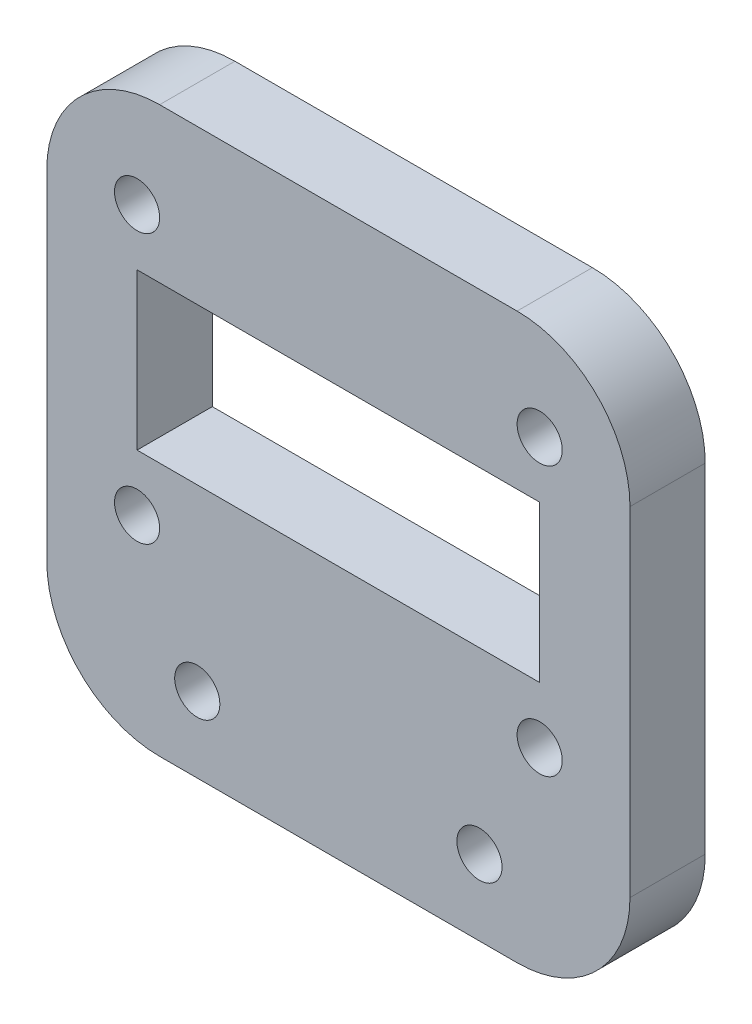
ISO-10303-21;
HEADER;
FILE_DESCRIPTION(('STEP AP214'),'2;1');
FILE_NAME('part.step','',(''),(''),'','','');
FILE_SCHEMA(('AUTOMOTIVE_DESIGN { 1 0 10303 214 1 1 1 1 }'));
ENDSEC;
DATA;
#1=APPLICATION_CONTEXT('core data for automotive mechanical design processes');
#2=APPLICATION_PROTOCOL_DEFINITION('international standard','automotive_design',2000,#1);
#3=PRODUCT_CONTEXT('',#1,'mechanical');
#4=PRODUCT('Part','Part','',(#3));
#5=PRODUCT_RELATED_PRODUCT_CATEGORY('part','',(#4));
#6=PRODUCT_DEFINITION_FORMATION('','',#4);
#7=PRODUCT_DEFINITION_CONTEXT('part definition',#1,'design');
#8=PRODUCT_DEFINITION('design','',#6,#7);
#9=PRODUCT_DEFINITION_SHAPE('','',#8);
#10=(LENGTH_UNIT() NAMED_UNIT(*) SI_UNIT(.MILLI.,.METRE.));
#11=(NAMED_UNIT(*) PLANE_ANGLE_UNIT() SI_UNIT($,.RADIAN.));
#12=(NAMED_UNIT(*) SI_UNIT($,.STERADIAN.) SOLID_ANGLE_UNIT());
#13=UNCERTAINTY_MEASURE_WITH_UNIT(LENGTH_MEASURE(1.E-05),#10,'distance_accuracy_value','');
#14=(GEOMETRIC_REPRESENTATION_CONTEXT(3) GLOBAL_UNCERTAINTY_ASSIGNED_CONTEXT((#13)) GLOBAL_UNIT_ASSIGNED_CONTEXT((#10,
#11,#12)) REPRESENTATION_CONTEXT('',''));
#15=CARTESIAN_POINT('',(0.,0.,0.));
#16=DIRECTION('',(0.,0.,1.));
#17=DIRECTION('',(1.,0.,0.));
#18=AXIS2_PLACEMENT_3D('',#15,#16,#17);
#19=CARTESIAN_POINT('',(0.,-15.,4.));
#20=DIRECTION('',(0.,1.,0.));
#21=DIRECTION('',(0.,0.,1.));
#22=AXIS2_PLACEMENT_3D('',#19,#20,#21);
#23=PLANE('',#22);
#24=DIRECTION('',(1.,0.,0.));
#25=VECTOR('',#24,1.);
#26=CARTESIAN_POINT('',(0.,-15.,0.));
#27=LINE('',#26,#25);
#28=CARTESIAN_POINT('',(-9.5,-15.,0.));
#29=VERTEX_POINT('',#28);
#30=CARTESIAN_POINT('',(9.5,-15.,0.));
#31=VERTEX_POINT('',#30);
#32=EDGE_CURVE('E213',#29,#31,#27,.T.);
#33=ORIENTED_EDGE('',*,*,#32,.T.);
#34=DIRECTION('',(0.,0.,-1.));
#35=VECTOR('',#34,1.);
#36=CARTESIAN_POINT('',(9.5,-15.,4.));
#37=LINE('',#36,#35);
#38=CARTESIAN_POINT('',(9.5,-15.,4.));
#39=VERTEX_POINT('',#38);
#40=EDGE_CURVE('E243',#31,#39,#37,.F.);
#41=ORIENTED_EDGE('',*,*,#40,.T.);
#42=DIRECTION('',(1.,0.,0.));
#43=VECTOR('',#42,1.);
#44=CARTESIAN_POINT('',(0.,-15.,4.));
#45=LINE('',#44,#43);
#46=CARTESIAN_POINT('',(-9.5,-15.,4.));
#47=VERTEX_POINT('',#46);
#48=EDGE_CURVE('E173',#47,#39,#45,.T.);
#49=ORIENTED_EDGE('',*,*,#48,.F.);
#50=DIRECTION('',(0.,0.,-1.));
#51=VECTOR('',#50,1.);
#52=CARTESIAN_POINT('',(-9.5,-15.,0.));
#53=LINE('',#52,#51);
#54=EDGE_CURVE('E240',#47,#29,#53,.T.);
#55=ORIENTED_EDGE('',*,*,#54,.T.);
#56=EDGE_LOOP('',(#33,#41,#49,#55));
#57=FACE_BOUND('',#56,.T.);
#58=ADVANCED_FACE('F39',(#57),#23,.F.);
#59=CARTESIAN_POINT('',(15.5,0.,4.));
#60=DIRECTION('',(-1.,0.,0.));
#61=DIRECTION('',(0.,0.,1.));
#62=AXIS2_PLACEMENT_3D('',#59,#60,#61);
#63=PLANE('',#62);
#64=DIRECTION('',(0.,1.,0.));
#65=VECTOR('',#64,1.);
#66=CARTESIAN_POINT('',(15.5,0.,4.));
#67=LINE('',#66,#65);
#68=CARTESIAN_POINT('',(15.5,-9.,4.));
#69=VERTEX_POINT('',#68);
#70=CARTESIAN_POINT('',(15.5,9.,4.));
#71=VERTEX_POINT('',#70);
#72=EDGE_CURVE('E176',#69,#71,#67,.T.);
#73=ORIENTED_EDGE('',*,*,#72,.F.);
#74=DIRECTION('',(0.,0.,-1.));
#75=VECTOR('',#74,1.);
#76=CARTESIAN_POINT('',(15.5,-9.,4.));
#77=LINE('',#76,#75);
#78=CARTESIAN_POINT('',(15.5,-9.,0.));
#79=VERTEX_POINT('',#78);
#80=EDGE_CURVE('E229',#69,#79,#77,.T.);
#81=ORIENTED_EDGE('',*,*,#80,.T.);
#82=DIRECTION('',(0.,1.,0.));
#83=VECTOR('',#82,1.);
#84=CARTESIAN_POINT('',(15.5,0.,0.));
#85=LINE('',#84,#83);
#86=CARTESIAN_POINT('',(15.5,9.,0.));
#87=VERTEX_POINT('',#86);
#88=EDGE_CURVE('E216',#79,#87,#85,.T.);
#89=ORIENTED_EDGE('',*,*,#88,.T.);
#90=DIRECTION('',(0.,0.,-1.));
#91=VECTOR('',#90,1.);
#92=CARTESIAN_POINT('',(15.5,9.,4.));
#93=LINE('',#92,#91);
#94=EDGE_CURVE('E140',#87,#71,#93,.F.);
#95=ORIENTED_EDGE('',*,*,#94,.T.);
#96=EDGE_LOOP('',(#73,#81,#89,#95));
#97=FACE_BOUND('',#96,.T.);
#98=ADVANCED_FACE('F285',(#97),#63,.F.);
#99=CARTESIAN_POINT('',(0.,15.,4.));
#100=DIRECTION('',(0.,1.,0.));
#101=DIRECTION('',(0.,0.,1.));
#102=AXIS2_PLACEMENT_3D('',#99,#100,#101);
#103=PLANE('',#102);
#104=DIRECTION('',(1.,0.,0.));
#105=VECTOR('',#104,1.);
#106=CARTESIAN_POINT('',(0.,15.,0.));
#107=LINE('',#106,#105);
#108=CARTESIAN_POINT('',(-9.5,15.,0.));
#109=VERTEX_POINT('',#108);
#110=CARTESIAN_POINT('',(9.5,15.,0.));
#111=VERTEX_POINT('',#110);
#112=EDGE_CURVE('E219',#109,#111,#107,.T.);
#113=ORIENTED_EDGE('',*,*,#112,.F.);
#114=DIRECTION('',(0.,0.,-1.));
#115=VECTOR('',#114,1.);
#116=CARTESIAN_POINT('',(-9.5,15.,4.));
#117=LINE('',#116,#115);
#118=CARTESIAN_POINT('',(-9.5,15.,4.));
#119=VERTEX_POINT('',#118);
#120=EDGE_CURVE('E11',#109,#119,#117,.F.);
#121=ORIENTED_EDGE('',*,*,#120,.T.);
#122=DIRECTION('',(1.,0.,0.));
#123=VECTOR('',#122,1.);
#124=CARTESIAN_POINT('',(0.,15.,4.));
#125=LINE('',#124,#123);
#126=CARTESIAN_POINT('',(9.5,15.,4.));
#127=VERTEX_POINT('',#126);
#128=EDGE_CURVE('E179',#119,#127,#125,.T.);
#129=ORIENTED_EDGE('',*,*,#128,.T.);
#130=DIRECTION('',(0.,0.,-1.));
#131=VECTOR('',#130,1.);
#132=CARTESIAN_POINT('',(9.5,15.,0.));
#133=LINE('',#132,#131);
#134=EDGE_CURVE('E47',#127,#111,#133,.T.);
#135=ORIENTED_EDGE('',*,*,#134,.T.);
#136=EDGE_LOOP('',(#113,#121,#129,#135));
#137=FACE_BOUND('',#136,.T.);
#138=ADVANCED_FACE('F259',(#137),#103,.T.);
#139=CARTESIAN_POINT('',(-10.7,0.,4.));
#140=DIRECTION('',(1.,0.,0.));
#141=DIRECTION('',(0.,0.,-1.));
#142=AXIS2_PLACEMENT_3D('',#139,#140,#141);
#143=PLANE('',#142);
#144=DIRECTION('',(0.,-1.,0.));
#145=VECTOR('',#144,1.);
#146=CARTESIAN_POINT('',(-10.7,0.,0.));
#147=LINE('',#146,#145);
#148=CARTESIAN_POINT('',(-10.7,6.8,0.));
#149=VERTEX_POINT('',#148);
#150=CARTESIAN_POINT('',(-10.7,-1.5,0.));
#151=VERTEX_POINT('',#150);
#152=EDGE_CURVE('E136',#149,#151,#147,.T.);
#153=ORIENTED_EDGE('',*,*,#152,.F.);
#154=DIRECTION('',(0.,0.,-1.));
#155=VECTOR('',#154,1.);
#156=CARTESIAN_POINT('',(-10.7,6.8,4.));
#157=LINE('',#156,#155);
#158=CARTESIAN_POINT('',(-10.7,6.8,4.));
#159=VERTEX_POINT('',#158);
#160=EDGE_CURVE('E129',#159,#149,#157,.T.);
#161=ORIENTED_EDGE('',*,*,#160,.F.);
#162=DIRECTION('',(0.,-1.,0.));
#163=VECTOR('',#162,1.);
#164=CARTESIAN_POINT('',(-10.7,0.,4.));
#165=LINE('',#164,#163);
#166=CARTESIAN_POINT('',(-10.7,-1.5,4.));
#167=VERTEX_POINT('',#166);
#168=EDGE_CURVE('E133',#159,#167,#165,.T.);
#169=ORIENTED_EDGE('',*,*,#168,.T.);
#170=DIRECTION('',(0.,0.,-1.));
#171=VECTOR('',#170,1.);
#172=CARTESIAN_POINT('',(-10.7,-1.5,4.));
#173=LINE('',#172,#171);
#174=EDGE_CURVE('E190',#167,#151,#173,.T.);
#175=ORIENTED_EDGE('',*,*,#174,.T.);
#176=EDGE_LOOP('',(#153,#161,#169,#175));
#177=FACE_BOUND('',#176,.T.);
#178=ADVANCED_FACE('F131',(#177),#143,.T.);
#179=CARTESIAN_POINT('',(0.,6.8,4.));
#180=DIRECTION('',(0.,1.,0.));
#181=DIRECTION('',(0.,0.,1.));
#182=AXIS2_PLACEMENT_3D('',#179,#180,#181);
#183=PLANE('',#182);
#184=DIRECTION('',(1.,0.,0.));
#185=VECTOR('',#184,1.);
#186=CARTESIAN_POINT('',(0.,6.8,0.));
#187=LINE('',#186,#185);
#188=CARTESIAN_POINT('',(10.7,6.8,0.));
#189=VERTEX_POINT('',#188);
#190=EDGE_CURVE('E196',#149,#189,#187,.T.);
#191=ORIENTED_EDGE('',*,*,#190,.T.);
#192=DIRECTION('',(0.,0.,-1.));
#193=VECTOR('',#192,1.);
#194=CARTESIAN_POINT('',(10.7,6.8,4.));
#195=LINE('',#194,#193);
#196=CARTESIAN_POINT('',(10.7,6.8,4.));
#197=VERTEX_POINT('',#196);
#198=EDGE_CURVE('E141',#197,#189,#195,.T.);
#199=ORIENTED_EDGE('',*,*,#198,.F.);
#200=DIRECTION('',(1.,0.,0.));
#201=VECTOR('',#200,1.);
#202=CARTESIAN_POINT('',(0.,6.8,4.));
#203=LINE('',#202,#201);
#204=EDGE_CURVE('E145',#159,#197,#203,.T.);
#205=ORIENTED_EDGE('',*,*,#204,.F.);
#206=ORIENTED_EDGE('',*,*,#160,.T.);
#207=EDGE_LOOP('',(#191,#199,#205,#206));
#208=FACE_BOUND('',#207,.T.);
#209=ADVANCED_FACE('F146',(#208),#183,.F.);
#210=CARTESIAN_POINT('',(10.7,0.,4.));
#211=DIRECTION('',(1.,0.,0.));
#212=DIRECTION('',(0.,1.,0.));
#213=AXIS2_PLACEMENT_3D('',#210,#211,#212);
#214=PLANE('',#213);
#215=DIRECTION('',(0.,-1.,0.));
#216=VECTOR('',#215,1.);
#217=CARTESIAN_POINT('',(10.7,0.,0.));
#218=LINE('',#217,#216);
#219=CARTESIAN_POINT('',(10.7,-1.5,0.));
#220=VERTEX_POINT('',#219);
#221=EDGE_CURVE('E198',#189,#220,#218,.T.);
#222=ORIENTED_EDGE('',*,*,#221,.T.);
#223=DIRECTION('',(0.,0.,-1.));
#224=VECTOR('',#223,1.);
#225=CARTESIAN_POINT('',(10.7,-1.5,4.));
#226=LINE('',#225,#224);
#227=CARTESIAN_POINT('',(10.7,-1.5,4.));
#228=VERTEX_POINT('',#227);
#229=EDGE_CURVE('E225',#228,#220,#226,.T.);
#230=ORIENTED_EDGE('',*,*,#229,.F.);
#231=DIRECTION('',(0.,-1.,0.));
#232=VECTOR('',#231,1.);
#233=CARTESIAN_POINT('',(10.7,0.,4.));
#234=LINE('',#233,#232);
#235=EDGE_CURVE('E149',#197,#228,#234,.T.);
#236=ORIENTED_EDGE('',*,*,#235,.F.);
#237=ORIENTED_EDGE('',*,*,#198,.T.);
#238=EDGE_LOOP('',(#222,#230,#236,#237));
#239=FACE_BOUND('',#238,.T.);
#240=ADVANCED_FACE('F316',(#239),#214,.F.);
#241=CARTESIAN_POINT('',(-7.5,-11.,4.));
#242=DIRECTION('',(0.,0.,-1.));
#243=DIRECTION('',(-1.,0.,0.));
#244=AXIS2_PLACEMENT_3D('',#241,#242,#243);
#245=CYLINDRICAL_SURFACE('',#244,1.2);
#246=CARTESIAN_POINT('',(-7.5,-11.,2.));
#247=DIRECTION('',(0.,0.,1.));
#248=DIRECTION('',(1.,0.,0.));
#249=AXIS2_PLACEMENT_3D('',#246,#247,#248);
#250=CIRCLE('',#249,1.2);
#251=CARTESIAN_POINT('',(-6.3,-11.,2.));
#252=VERTEX_POINT('',#251);
#253=EDGE_CURVE('E572',#252,#252,#250,.T.);
#254=ORIENTED_EDGE('',*,*,#253,.F.);
#255=EDGE_LOOP('',(#254));
#256=FACE_BOUND('',#255,.T.);
#257=CARTESIAN_POINT('',(-7.5,-11.,4.));
#258=DIRECTION('',(0.,0.,1.));
#259=DIRECTION('',(1.,0.,0.));
#260=AXIS2_PLACEMENT_3D('',#257,#258,#259);
#261=CIRCLE('',#260,1.2);
#262=CARTESIAN_POINT('',(-6.3,-11.,4.));
#263=VERTEX_POINT('',#262);
#264=EDGE_CURVE('E184',#263,#263,#261,.T.);
#265=ORIENTED_EDGE('',*,*,#264,.T.);
#266=EDGE_LOOP('',(#265));
#267=FACE_BOUND('',#266,.T.);
#268=ADVANCED_FACE('F319',(#256,#267),#245,.F.);
#269=CARTESIAN_POINT('',(-15.5,0.,4.));
#270=DIRECTION('',(-1.,0.,0.));
#271=DIRECTION('',(0.,0.,1.));
#272=AXIS2_PLACEMENT_3D('',#269,#270,#271);
#273=PLANE('',#272);
#274=DIRECTION('',(0.,1.,0.));
#275=VECTOR('',#274,1.);
#276=CARTESIAN_POINT('',(-15.5,0.,0.));
#277=LINE('',#276,#275);
#278=CARTESIAN_POINT('',(-15.5,-9.,0.));
#279=VERTEX_POINT('',#278);
#280=CARTESIAN_POINT('',(-15.5,9.,0.));
#281=VERTEX_POINT('',#280);
#282=EDGE_CURVE('E158',#279,#281,#277,.T.);
#283=ORIENTED_EDGE('',*,*,#282,.F.);
#284=DIRECTION('',(0.,0.,-1.));
#285=VECTOR('',#284,1.);
#286=CARTESIAN_POINT('',(-15.5,-9.,4.));
#287=LINE('',#286,#285);
#288=CARTESIAN_POINT('',(-15.5,-9.,4.));
#289=VERTEX_POINT('',#288);
#290=EDGE_CURVE('E61',#279,#289,#287,.F.);
#291=ORIENTED_EDGE('',*,*,#290,.T.);
#292=DIRECTION('',(0.,1.,0.));
#293=VECTOR('',#292,1.);
#294=CARTESIAN_POINT('',(-15.5,0.,4.));
#295=LINE('',#294,#293);
#296=CARTESIAN_POINT('',(-15.5,9.,4.));
#297=VERTEX_POINT('',#296);
#298=EDGE_CURVE('E182',#289,#297,#295,.T.);
#299=ORIENTED_EDGE('',*,*,#298,.T.);
#300=DIRECTION('',(0.,0.,-1.));
#301=VECTOR('',#300,1.);
#302=CARTESIAN_POINT('',(-15.5,9.,4.));
#303=LINE('',#302,#301);
#304=EDGE_CURVE('E252',#297,#281,#303,.T.);
#305=ORIENTED_EDGE('',*,*,#304,.T.);
#306=EDGE_LOOP('',(#283,#291,#299,#305));
#307=FACE_BOUND('',#306,.T.);
#308=ADVANCED_FACE('F269',(#307),#273,.T.);
#309=CARTESIAN_POINT('',(10.7,9.8,4.));
#310=DIRECTION('',(0.,0.,-1.));
#311=DIRECTION('',(-1.,0.,0.));
#312=AXIS2_PLACEMENT_3D('',#309,#310,#311);
#313=CYLINDRICAL_SURFACE('',#312,1.2);
#314=CARTESIAN_POINT('',(10.7,9.8,4.));
#315=DIRECTION('',(0.,0.,1.));
#316=DIRECTION('',(1.,0.,0.));
#317=AXIS2_PLACEMENT_3D('',#314,#315,#316);
#318=CIRCLE('',#317,1.2);
#319=CARTESIAN_POINT('',(11.9,9.8,4.));
#320=VERTEX_POINT('',#319);
#321=EDGE_CURVE('E170',#320,#320,#318,.T.);
#322=ORIENTED_EDGE('',*,*,#321,.T.);
#323=EDGE_LOOP('',(#322));
#324=FACE_BOUND('',#323,.T.);
#325=CARTESIAN_POINT('',(10.7,9.8,0.));
#326=DIRECTION('',(0.,0.,1.));
#327=DIRECTION('',(1.,0.,0.));
#328=AXIS2_PLACEMENT_3D('',#325,#326,#327);
#329=CIRCLE('',#328,1.2);
#330=CARTESIAN_POINT('',(11.9,9.8,0.));
#331=VERTEX_POINT('',#330);
#332=EDGE_CURVE('E210',#331,#331,#329,.T.);
#333=ORIENTED_EDGE('',*,*,#332,.F.);
#334=EDGE_LOOP('',(#333));
#335=FACE_BOUND('',#334,.T.);
#336=ADVANCED_FACE('F299',(#324,#335),#313,.F.);
#337=CARTESIAN_POINT('',(10.7,-4.5,4.));
#338=DIRECTION('',(0.,0.,-1.));
#339=DIRECTION('',(-1.,0.,0.));
#340=AXIS2_PLACEMENT_3D('',#337,#338,#339);
#341=CYLINDRICAL_SURFACE('',#340,1.2);
#342=CARTESIAN_POINT('',(10.7,-4.5,4.));
#343=DIRECTION('',(0.,0.,1.));
#344=DIRECTION('',(1.,0.,0.));
#345=AXIS2_PLACEMENT_3D('',#342,#343,#344);
#346=CIRCLE('',#345,1.2);
#347=CARTESIAN_POINT('',(11.9,-4.5,4.));
#348=VERTEX_POINT('',#347);
#349=EDGE_CURVE('E167',#348,#348,#346,.T.);
#350=ORIENTED_EDGE('',*,*,#349,.T.);
#351=EDGE_LOOP('',(#350));
#352=FACE_BOUND('',#351,.T.);
#353=CARTESIAN_POINT('',(10.7,-4.5,0.));
#354=DIRECTION('',(0.,0.,1.));
#355=DIRECTION('',(1.,0.,0.));
#356=AXIS2_PLACEMENT_3D('',#353,#354,#355);
#357=CIRCLE('',#356,1.2);
#358=CARTESIAN_POINT('',(11.9,-4.5,0.));
#359=VERTEX_POINT('',#358);
#360=EDGE_CURVE('E207',#359,#359,#357,.T.);
#361=ORIENTED_EDGE('',*,*,#360,.F.);
#362=EDGE_LOOP('',(#361));
#363=FACE_BOUND('',#362,.T.);
#364=ADVANCED_FACE('F302',(#352,#363),#341,.F.);
#365=CARTESIAN_POINT('',(-10.7,9.8,4.));
#366=DIRECTION('',(0.,0.,-1.));
#367=DIRECTION('',(-1.,0.,0.));
#368=AXIS2_PLACEMENT_3D('',#365,#366,#367);
#369=CYLINDRICAL_SURFACE('',#368,1.2);
#370=CARTESIAN_POINT('',(-10.7,9.8,4.));
#371=DIRECTION('',(0.,0.,1.));
#372=DIRECTION('',(1.,0.,0.));
#373=AXIS2_PLACEMENT_3D('',#370,#371,#372);
#374=CIRCLE('',#373,1.2);
#375=CARTESIAN_POINT('',(-9.49999999999999,9.8,4.));
#376=VERTEX_POINT('',#375);
#377=EDGE_CURVE('E164',#376,#376,#374,.T.);
#378=ORIENTED_EDGE('',*,*,#377,.T.);
#379=EDGE_LOOP('',(#378));
#380=FACE_BOUND('',#379,.T.);
#381=CARTESIAN_POINT('',(-10.7,9.8,0.));
#382=DIRECTION('',(0.,0.,1.));
#383=DIRECTION('',(1.,0.,0.));
#384=AXIS2_PLACEMENT_3D('',#381,#382,#383);
#385=CIRCLE('',#384,1.2);
#386=CARTESIAN_POINT('',(-9.49999999999999,9.8,0.));
#387=VERTEX_POINT('',#386);
#388=EDGE_CURVE('E204',#387,#387,#385,.T.);
#389=ORIENTED_EDGE('',*,*,#388,.F.);
#390=EDGE_LOOP('',(#389));
#391=FACE_BOUND('',#390,.T.);
#392=ADVANCED_FACE('F306',(#380,#391),#369,.F.);
#393=CARTESIAN_POINT('',(0.,-1.5,4.));
#394=DIRECTION('',(0.,1.,0.));
#395=DIRECTION('',(0.,0.,1.));
#396=AXIS2_PLACEMENT_3D('',#393,#394,#395);
#397=PLANE('',#396);
#398=DIRECTION('',(1.,0.,0.));
#399=VECTOR('',#398,1.);
#400=CARTESIAN_POINT('',(0.,-1.5,0.));
#401=LINE('',#400,#399);
#402=EDGE_CURVE('E201',#151,#220,#401,.T.);
#403=ORIENTED_EDGE('',*,*,#402,.F.);
#404=ORIENTED_EDGE('',*,*,#174,.F.);
#405=DIRECTION('',(1.,0.,0.));
#406=VECTOR('',#405,1.);
#407=CARTESIAN_POINT('',(0.,-1.5,4.));
#408=LINE('',#407,#406);
#409=EDGE_CURVE('E154',#167,#228,#408,.T.);
#410=ORIENTED_EDGE('',*,*,#409,.T.);
#411=ORIENTED_EDGE('',*,*,#229,.T.);
#412=EDGE_LOOP('',(#403,#404,#410,#411));
#413=FACE_BOUND('',#412,.T.);
#414=ADVANCED_FACE('F310',(#413),#397,.T.);
#415=CARTESIAN_POINT('',(-10.7,-4.5,4.));
#416=DIRECTION('',(0.,0.,-1.));
#417=DIRECTION('',(-1.,0.,0.));
#418=AXIS2_PLACEMENT_3D('',#415,#416,#417);
#419=CYLINDRICAL_SURFACE('',#418,1.2);
#420=CARTESIAN_POINT('',(-10.7,-4.5,4.));
#421=DIRECTION('',(0.,0.,1.));
#422=DIRECTION('',(1.,0.,0.));
#423=AXIS2_PLACEMENT_3D('',#420,#421,#422);
#424=CIRCLE('',#423,1.2);
#425=CARTESIAN_POINT('',(-9.49999999999998,-4.5,4.));
#426=VERTEX_POINT('',#425);
#427=EDGE_CURVE('E155',#426,#426,#424,.T.);
#428=ORIENTED_EDGE('',*,*,#427,.T.);
#429=EDGE_LOOP('',(#428));
#430=FACE_BOUND('',#429,.T.);
#431=CARTESIAN_POINT('',(-10.7,-4.5,0.));
#432=DIRECTION('',(0.,0.,1.));
#433=DIRECTION('',(1.,0.,0.));
#434=AXIS2_PLACEMENT_3D('',#431,#432,#433);
#435=CIRCLE('',#434,1.2);
#436=CARTESIAN_POINT('',(-9.49999999999998,-4.5,0.));
#437=VERTEX_POINT('',#436);
#438=EDGE_CURVE('E191',#437,#437,#435,.T.);
#439=ORIENTED_EDGE('',*,*,#438,.F.);
#440=EDGE_LOOP('',(#439));
#441=FACE_BOUND('',#440,.T.);
#442=ADVANCED_FACE('F314',(#430,#441),#419,.F.);
#443=CARTESIAN_POINT('',(7.5,-11.,4.));
#444=DIRECTION('',(0.,0.,-1.));
#445=DIRECTION('',(-1.,0.,0.));
#446=AXIS2_PLACEMENT_3D('',#443,#444,#445);
#447=CYLINDRICAL_SURFACE('',#446,1.2);
#448=CARTESIAN_POINT('',(7.5,-11.,2.));
#449=DIRECTION('',(0.,0.,1.));
#450=DIRECTION('',(1.,0.,0.));
#451=AXIS2_PLACEMENT_3D('',#448,#449,#450);
#452=CIRCLE('',#451,1.2);
#453=CARTESIAN_POINT('',(8.7,-11.,2.));
#454=VERTEX_POINT('',#453);
#455=EDGE_CURVE('E585',#454,#454,#452,.T.);
#456=ORIENTED_EDGE('',*,*,#455,.F.);
#457=EDGE_LOOP('',(#456));
#458=FACE_BOUND('',#457,.T.);
#459=CARTESIAN_POINT('',(7.5,-11.,4.));
#460=DIRECTION('',(0.,0.,1.));
#461=DIRECTION('',(1.,0.,0.));
#462=AXIS2_PLACEMENT_3D('',#459,#460,#461);
#463=CIRCLE('',#462,1.2);
#464=CARTESIAN_POINT('',(8.7,-11.,4.));
#465=VERTEX_POINT('',#464);
#466=EDGE_CURVE('E187',#465,#465,#463,.T.);
#467=ORIENTED_EDGE('',*,*,#466,.T.);
#468=EDGE_LOOP('',(#467));
#469=FACE_BOUND('',#468,.T.);
#470=ADVANCED_FACE('F327',(#458,#469),#447,.F.);
#471=CARTESIAN_POINT('',(0.,0.,4.));
#472=DIRECTION('',(0.,0.,1.));
#473=DIRECTION('',(1.,0.,0.));
#474=AXIS2_PLACEMENT_3D('',#471,#472,#473);
#475=PLANE('',#474);
#476=ORIENTED_EDGE('',*,*,#427,.F.);
#477=EDGE_LOOP('',(#476));
#478=FACE_BOUND('',#477,.T.);
#479=ORIENTED_EDGE('',*,*,#168,.F.);
#480=ORIENTED_EDGE('',*,*,#204,.T.);
#481=ORIENTED_EDGE('',*,*,#235,.T.);
#482=ORIENTED_EDGE('',*,*,#409,.F.);
#483=EDGE_LOOP('',(#479,#480,#481,#482));
#484=FACE_BOUND('',#483,.T.);
#485=ORIENTED_EDGE('',*,*,#377,.F.);
#486=EDGE_LOOP('',(#485));
#487=FACE_BOUND('',#486,.T.);
#488=ORIENTED_EDGE('',*,*,#349,.F.);
#489=EDGE_LOOP('',(#488));
#490=FACE_BOUND('',#489,.T.);
#491=ORIENTED_EDGE('',*,*,#321,.F.);
#492=EDGE_LOOP('',(#491));
#493=FACE_BOUND('',#492,.T.);
#494=ORIENTED_EDGE('',*,*,#48,.T.);
#495=CARTESIAN_POINT('',(9.5,-9.,4.));
#496=DIRECTION('',(0.,0.,1.));
#497=DIRECTION('',(1.,0.,0.));
#498=AXIS2_PLACEMENT_3D('',#495,#496,#497);
#499=CIRCLE('',#498,6.);
#500=EDGE_CURVE('E250',#39,#69,#499,.T.);
#501=ORIENTED_EDGE('',*,*,#500,.T.);
#502=ORIENTED_EDGE('',*,*,#72,.T.);
#503=CARTESIAN_POINT('',(9.5,9.,4.));
#504=DIRECTION('',(0.,0.,1.));
#505=DIRECTION('',(1.,0.,0.));
#506=AXIS2_PLACEMENT_3D('',#503,#504,#505);
#507=CIRCLE('',#506,6.);
#508=EDGE_CURVE('E245',#71,#127,#507,.T.);
#509=ORIENTED_EDGE('',*,*,#508,.T.);
#510=ORIENTED_EDGE('',*,*,#128,.F.);
#511=CARTESIAN_POINT('',(-9.5,9.,4.));
#512=DIRECTION('',(0.,0.,1.));
#513=DIRECTION('',(1.,0.,0.));
#514=AXIS2_PLACEMENT_3D('',#511,#512,#513);
#515=CIRCLE('',#514,6.);
#516=EDGE_CURVE('E54',#119,#297,#515,.T.);
#517=ORIENTED_EDGE('',*,*,#516,.T.);
#518=ORIENTED_EDGE('',*,*,#298,.F.);
#519=CARTESIAN_POINT('',(-9.5,-9.,4.));
#520=DIRECTION('',(0.,0.,1.));
#521=DIRECTION('',(1.,0.,0.));
#522=AXIS2_PLACEMENT_3D('',#519,#520,#521);
#523=CIRCLE('',#522,6.);
#524=EDGE_CURVE('E248',#289,#47,#523,.T.);
#525=ORIENTED_EDGE('',*,*,#524,.T.);
#526=EDGE_LOOP('',(#494,#501,#502,#509,#510,#517,#518,#525));
#527=FACE_BOUND('',#526,.T.);
#528=ORIENTED_EDGE('',*,*,#264,.F.);
#529=EDGE_LOOP('',(#528));
#530=FACE_BOUND('',#529,.T.);
#531=ORIENTED_EDGE('',*,*,#466,.F.);
#532=EDGE_LOOP('',(#531));
#533=FACE_BOUND('',#532,.T.);
#534=ADVANCED_FACE('F151',(#478,#484,#487,#490,#493,#527,#530,#533),#475,.T.);
#535=CARTESIAN_POINT('',(0.,0.,0.));
#536=DIRECTION('',(0.,0.,1.));
#537=DIRECTION('',(1.,0.,0.));
#538=AXIS2_PLACEMENT_3D('',#535,#536,#537);
#539=PLANE('',#538);
#540=CARTESIAN_POINT('',(-7.5,-11.,0.));
#541=DIRECTION('',(0.,0.,1.));
#542=DIRECTION('',(1.,0.,0.));
#543=AXIS2_PLACEMENT_3D('',#540,#541,#542);
#544=CIRCLE('',#543,2.8);
#545=CARTESIAN_POINT('',(-4.7,-11.,0.));
#546=VERTEX_POINT('',#545);
#547=EDGE_CURVE('E577',#546,#546,#544,.T.);
#548=ORIENTED_EDGE('',*,*,#547,.T.);
#549=EDGE_LOOP('',(#548));
#550=FACE_BOUND('',#549,.T.);
#551=CARTESIAN_POINT('',(7.5,-11.,0.));
#552=DIRECTION('',(0.,0.,1.));
#553=DIRECTION('',(1.,0.,0.));
#554=AXIS2_PLACEMENT_3D('',#551,#552,#553);
#555=CIRCLE('',#554,2.8);
#556=CARTESIAN_POINT('',(10.3,-11.,0.));
#557=VERTEX_POINT('',#556);
#558=EDGE_CURVE('E588',#557,#557,#555,.T.);
#559=ORIENTED_EDGE('',*,*,#558,.T.);
#560=EDGE_LOOP('',(#559));
#561=FACE_BOUND('',#560,.T.);
#562=ORIENTED_EDGE('',*,*,#438,.T.);
#563=EDGE_LOOP('',(#562));
#564=FACE_BOUND('',#563,.T.);
#565=ORIENTED_EDGE('',*,*,#152,.T.);
#566=ORIENTED_EDGE('',*,*,#402,.T.);
#567=ORIENTED_EDGE('',*,*,#221,.F.);
#568=ORIENTED_EDGE('',*,*,#190,.F.);
#569=EDGE_LOOP('',(#565,#566,#567,#568));
#570=FACE_BOUND('',#569,.T.);
#571=ORIENTED_EDGE('',*,*,#388,.T.);
#572=EDGE_LOOP('',(#571));
#573=FACE_BOUND('',#572,.T.);
#574=ORIENTED_EDGE('',*,*,#360,.T.);
#575=EDGE_LOOP('',(#574));
#576=FACE_BOUND('',#575,.T.);
#577=ORIENTED_EDGE('',*,*,#332,.T.);
#578=EDGE_LOOP('',(#577));
#579=FACE_BOUND('',#578,.T.);
#580=ORIENTED_EDGE('',*,*,#88,.F.);
#581=CARTESIAN_POINT('',(9.5,-9.,0.));
#582=DIRECTION('',(0.,0.,1.));
#583=DIRECTION('',(1.,0.,0.));
#584=AXIS2_PLACEMENT_3D('',#581,#582,#583);
#585=CIRCLE('',#584,6.);
#586=EDGE_CURVE('E238',#79,#31,#585,.F.);
#587=ORIENTED_EDGE('',*,*,#586,.T.);
#588=ORIENTED_EDGE('',*,*,#32,.F.);
#589=CARTESIAN_POINT('',(-9.5,-9.,0.));
#590=DIRECTION('',(0.,0.,1.));
#591=DIRECTION('',(1.,0.,0.));
#592=AXIS2_PLACEMENT_3D('',#589,#590,#591);
#593=CIRCLE('',#592,6.);
#594=EDGE_CURVE('E236',#29,#279,#593,.F.);
#595=ORIENTED_EDGE('',*,*,#594,.T.);
#596=ORIENTED_EDGE('',*,*,#282,.T.);
#597=CARTESIAN_POINT('',(-9.5,9.,0.));
#598=DIRECTION('',(0.,0.,1.));
#599=DIRECTION('',(1.,0.,0.));
#600=AXIS2_PLACEMENT_3D('',#597,#598,#599);
#601=CIRCLE('',#600,6.);
#602=EDGE_CURVE('E234',#281,#109,#601,.F.);
#603=ORIENTED_EDGE('',*,*,#602,.T.);
#604=ORIENTED_EDGE('',*,*,#112,.T.);
#605=CARTESIAN_POINT('',(9.5,9.,0.));
#606=DIRECTION('',(0.,0.,1.));
#607=DIRECTION('',(1.,0.,0.));
#608=AXIS2_PLACEMENT_3D('',#605,#606,#607);
#609=CIRCLE('',#608,6.);
#610=EDGE_CURVE('E232',#111,#87,#609,.F.);
#611=ORIENTED_EDGE('',*,*,#610,.T.);
#612=EDGE_LOOP('',(#580,#587,#588,#595,#596,#603,#604,#611));
#613=FACE_BOUND('',#612,.T.);
#614=ADVANCED_FACE('F265',(#550,#561,#564,#570,#573,#576,#579,#613),#539,.F.);
#615=CARTESIAN_POINT('',(7.5,-11.,2.));
#616=DIRECTION('',(0.,0.,-1.));
#617=DIRECTION('',(-1.,0.,0.));
#618=AXIS2_PLACEMENT_3D('',#615,#616,#617);
#619=CYLINDRICAL_SURFACE('',#618,2.8);
#620=CARTESIAN_POINT('',(7.5,-11.,2.));
#621=DIRECTION('',(0.,0.,1.));
#622=DIRECTION('',(1.,0.,0.));
#623=AXIS2_PLACEMENT_3D('',#620,#621,#622);
#624=CIRCLE('',#623,2.8);
#625=CARTESIAN_POINT('',(10.3,-11.,2.));
#626=VERTEX_POINT('',#625);
#627=EDGE_CURVE('E582',#626,#626,#624,.T.);
#628=ORIENTED_EDGE('',*,*,#627,.T.);
#629=EDGE_LOOP('',(#628));
#630=FACE_BOUND('',#629,.T.);
#631=ORIENTED_EDGE('',*,*,#558,.F.);
#632=EDGE_LOOP('',(#631));
#633=FACE_BOUND('',#632,.T.);
#634=ADVANCED_FACE('F387',(#630,#633),#619,.F.);
#635=CARTESIAN_POINT('',(0.,0.,2.));
#636=DIRECTION('',(0.,0.,1.));
#637=DIRECTION('',(1.,0.,0.));
#638=AXIS2_PLACEMENT_3D('',#635,#636,#637);
#639=PLANE('',#638);
#640=ORIENTED_EDGE('',*,*,#455,.T.);
#641=EDGE_LOOP('',(#640));
#642=FACE_BOUND('',#641,.T.);
#643=ORIENTED_EDGE('',*,*,#627,.F.);
#644=EDGE_LOOP('',(#643));
#645=FACE_BOUND('',#644,.T.);
#646=ADVANCED_FACE('F377',(#642,#645),#639,.F.);
#647=CARTESIAN_POINT('',(-7.5,-11.,2.));
#648=DIRECTION('',(0.,0.,-1.));
#649=DIRECTION('',(-1.,0.,0.));
#650=AXIS2_PLACEMENT_3D('',#647,#648,#649);
#651=CYLINDRICAL_SURFACE('',#650,2.8);
#652=CARTESIAN_POINT('',(-7.5,-11.,2.));
#653=DIRECTION('',(0.,0.,1.));
#654=DIRECTION('',(1.,0.,0.));
#655=AXIS2_PLACEMENT_3D('',#652,#653,#654);
#656=CIRCLE('',#655,2.8);
#657=CARTESIAN_POINT('',(-4.7,-11.,2.));
#658=VERTEX_POINT('',#657);
#659=EDGE_CURVE('E194',#658,#658,#656,.T.);
#660=ORIENTED_EDGE('',*,*,#659,.T.);
#661=EDGE_LOOP('',(#660));
#662=FACE_BOUND('',#661,.T.);
#663=ORIENTED_EDGE('',*,*,#547,.F.);
#664=EDGE_LOOP('',(#663));
#665=FACE_BOUND('',#664,.T.);
#666=ADVANCED_FACE('F367',(#662,#665),#651,.F.);
#667=CARTESIAN_POINT('',(0.,0.,2.));
#668=DIRECTION('',(0.,0.,1.));
#669=DIRECTION('',(1.,0.,0.));
#670=AXIS2_PLACEMENT_3D('',#667,#668,#669);
#671=PLANE('',#670);
#672=ORIENTED_EDGE('',*,*,#253,.T.);
#673=EDGE_LOOP('',(#672));
#674=FACE_BOUND('',#673,.T.);
#675=ORIENTED_EDGE('',*,*,#659,.F.);
#676=EDGE_LOOP('',(#675));
#677=FACE_BOUND('',#676,.T.);
#678=ADVANCED_FACE('F331',(#674,#677),#671,.F.);
#679=CARTESIAN_POINT('',(9.5,-9.,4.));
#680=DIRECTION('',(0.,0.,-1.));
#681=DIRECTION('',(-1.,0.,0.));
#682=AXIS2_PLACEMENT_3D('',#679,#680,#681);
#683=CYLINDRICAL_SURFACE('',#682,6.);
#684=ORIENTED_EDGE('',*,*,#500,.F.);
#685=ORIENTED_EDGE('',*,*,#40,.F.);
#686=ORIENTED_EDGE('',*,*,#586,.F.);
#687=ORIENTED_EDGE('',*,*,#80,.F.);
#688=EDGE_LOOP('',(#684,#685,#686,#687));
#689=FACE_BOUND('',#688,.T.);
#690=ADVANCED_FACE('F282',(#689),#683,.T.);
#691=CARTESIAN_POINT('',(-9.5,-9.,4.));
#692=DIRECTION('',(0.,0.,1.));
#693=DIRECTION('',(1.,0.,0.));
#694=AXIS2_PLACEMENT_3D('',#691,#692,#693);
#695=CYLINDRICAL_SURFACE('',#694,6.);
#696=ORIENTED_EDGE('',*,*,#524,.F.);
#697=ORIENTED_EDGE('',*,*,#290,.F.);
#698=ORIENTED_EDGE('',*,*,#594,.F.);
#699=ORIENTED_EDGE('',*,*,#54,.F.);
#700=EDGE_LOOP('',(#696,#697,#698,#699));
#701=FACE_BOUND('',#700,.T.);
#702=ADVANCED_FACE('F275',(#701),#695,.T.);
#703=CARTESIAN_POINT('',(-9.5,9.,4.));
#704=DIRECTION('',(0.,0.,-1.));
#705=DIRECTION('',(-1.,0.,0.));
#706=AXIS2_PLACEMENT_3D('',#703,#704,#705);
#707=CYLINDRICAL_SURFACE('',#706,6.);
#708=ORIENTED_EDGE('',*,*,#516,.F.);
#709=ORIENTED_EDGE('',*,*,#120,.F.);
#710=ORIENTED_EDGE('',*,*,#602,.F.);
#711=ORIENTED_EDGE('',*,*,#304,.F.);
#712=EDGE_LOOP('',(#708,#709,#710,#711));
#713=FACE_BOUND('',#712,.T.);
#714=ADVANCED_FACE('F268',(#713),#707,.T.);
#715=CARTESIAN_POINT('',(9.5,9.,4.));
#716=DIRECTION('',(0.,0.,1.));
#717=DIRECTION('',(1.,0.,0.));
#718=AXIS2_PLACEMENT_3D('',#715,#716,#717);
#719=CYLINDRICAL_SURFACE('',#718,6.);
#720=ORIENTED_EDGE('',*,*,#508,.F.);
#721=ORIENTED_EDGE('',*,*,#94,.F.);
#722=ORIENTED_EDGE('',*,*,#610,.F.);
#723=ORIENTED_EDGE('',*,*,#134,.F.);
#724=EDGE_LOOP('',(#720,#721,#722,#723));
#725=FACE_BOUND('',#724,.T.);
#726=ADVANCED_FACE('F41',(#725),#719,.T.);
#727=CLOSED_SHELL('',(#58,#98,#138,#178,#209,#240,#268,#308,#336,#364,#392,#414,#442,#470,#534,
#614,#634,#646,#666,#678,#690,#702,#714,#726));
#728=MANIFOLD_SOLID_BREP('B2',#727);
#729=ADVANCED_BREP_SHAPE_REPRESENTATION('',(#18,#728),#14);
#730=SHAPE_DEFINITION_REPRESENTATION(#9,#729);
ENDSEC;
END-ISO-10303-21;
